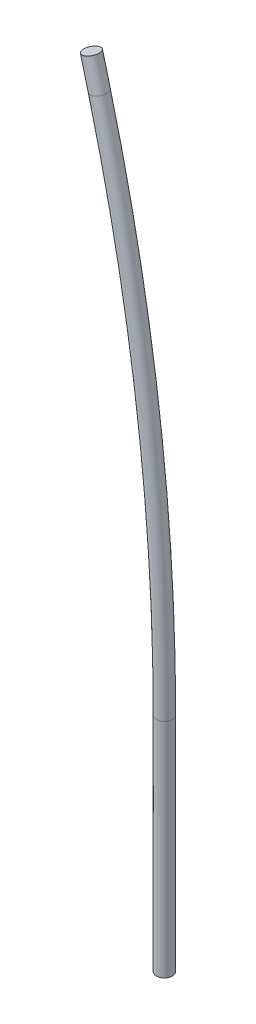
ISO-10303-21;
HEADER;
FILE_DESCRIPTION(('STEP AP214'),'2;1');
FILE_NAME('part.step','',(''),(''),'','','');
FILE_SCHEMA(('AUTOMOTIVE_DESIGN { 1 0 10303 214 1 1 1 1 }'));
ENDSEC;
DATA;
#1=APPLICATION_CONTEXT('core data for automotive mechanical design processes');
#2=APPLICATION_PROTOCOL_DEFINITION('international standard','automotive_design',2000,#1);
#3=PRODUCT_CONTEXT('',#1,'mechanical');
#4=PRODUCT('Part','Part','',(#3));
#5=PRODUCT_RELATED_PRODUCT_CATEGORY('part','',(#4));
#6=PRODUCT_DEFINITION_FORMATION('','',#4);
#7=PRODUCT_DEFINITION_CONTEXT('part definition',#1,'design');
#8=PRODUCT_DEFINITION('design','',#6,#7);
#9=PRODUCT_DEFINITION_SHAPE('','',#8);
#10=(LENGTH_UNIT() NAMED_UNIT(*) SI_UNIT(.MILLI.,.METRE.));
#11=(NAMED_UNIT(*) PLANE_ANGLE_UNIT() SI_UNIT($,.RADIAN.));
#12=(NAMED_UNIT(*) SI_UNIT($,.STERADIAN.) SOLID_ANGLE_UNIT());
#13=UNCERTAINTY_MEASURE_WITH_UNIT(LENGTH_MEASURE(1.E-05),#10,'distance_accuracy_value','');
#14=(GEOMETRIC_REPRESENTATION_CONTEXT(3) GLOBAL_UNCERTAINTY_ASSIGNED_CONTEXT((#13)) GLOBAL_UNIT_ASSIGNED_CONTEXT((#10,
#11,#12)) REPRESENTATION_CONTEXT('',''));
#15=CARTESIAN_POINT('',(0.,0.,0.));
#16=DIRECTION('',(0.,0.,1.));
#17=DIRECTION('',(1.,0.,0.));
#18=AXIS2_PLACEMENT_3D('',#15,#16,#17);
#19=CARTESIAN_POINT('',(-764.718109756101,0.,0.));
#20=DIRECTION('',(0.,0.,1.));
#21=DIRECTION('',(1.,0.,0.));
#22=AXIS2_PLACEMENT_3D('',#19,#20,#21);
#23=TOROIDAL_SURFACE('',#22,805.993109756101,3.175);
#24=CARTESIAN_POINT('',(41.275,0.,0.));
#25=DIRECTION('',(0.,-1.,0.));
#26=DIRECTION('',(0.,0.,-1.));
#27=AXIS2_PLACEMENT_3D('',#24,#25,#26);
#28=CIRCLE('',#27,3.175);
#29=CARTESIAN_POINT('',(44.45,0.,0.));
#30=VERTEX_POINT('',#29);
#31=EDGE_CURVE('E47',#30,#30,#28,.T.);
#32=CARTESIAN_POINT('',(15.2400000000001,203.2,0.));
#33=DIRECTION('',(-0.252111336363024,0.967698235028488,0.));
#34=DIRECTION('',(0.,0.,1.));
#35=AXIS2_PLACEMENT_3D('',#32,#33,#34);
#36=CIRCLE('',#35,3.175);
#37=CARTESIAN_POINT('',(18.3124418962156,204.000453492953,0.));
#38=VERTEX_POINT('',#37);
#39=EDGE_CURVE('E10',#38,#38,#36,.T.);
#40=CARTESIAN_POINT('',(-764.718109756101,0.,0.));
#41=DIRECTION('',(0.,0.,1.));
#42=DIRECTION('',(1.,0.,0.));
#43=AXIS2_PLACEMENT_3D('',#40,#41,#42);
#44=CIRCLE('',#43,809.168109756101);
#45=EDGE_CURVE('',#30,#38,#44,.T.);
#46=ORIENTED_EDGE('',*,*,#31,.F.);
#47=ORIENTED_EDGE('',*,*,#39,.F.);
#48=ORIENTED_EDGE('',*,*,#45,.T.);
#49=ORIENTED_EDGE('',*,*,#45,.F.);
#50=EDGE_LOOP('',(#46,#48,#47,#49));
#51=FACE_BOUND('',#50,.T.);
#52=ADVANCED_FACE('F33',(#51),#23,.T.);
#53=CARTESIAN_POINT('',(12.0381860281897,215.489767584862,0.));
#54=DIRECTION('',(0.252111336363024,-0.967698235028488,0.));
#55=DIRECTION('',(0.967698235028488,0.252111336363024,0.));
#56=AXIS2_PLACEMENT_3D('',#53,#54,#55);
#57=CYLINDRICAL_SURFACE('',#56,3.175);
#58=CARTESIAN_POINT('',(12.0381860281897,215.489767584862,0.));
#59=DIRECTION('',(-0.252111336363024,0.967698235028488,0.));
#60=DIRECTION('',(-0.967698235028488,-0.252111336363024,0.));
#61=AXIS2_PLACEMENT_3D('',#58,#59,#60);
#62=CIRCLE('',#61,3.175);
#63=CARTESIAN_POINT('',(15.1106279244051,216.290221077814,0.));
#64=VERTEX_POINT('',#63);
#65=EDGE_CURVE('E39',#64,#64,#62,.T.);
#66=CARTESIAN_POINT('',(15.1106279244051,216.290221077814,0.));
#67=CARTESIAN_POINT('',(15.1439801532782,216.162202665472,0.));
#68=CARTESIAN_POINT('',(15.1773323821512,216.03418425313,0.));
#69=CARTESIAN_POINT('',(15.2440368398972,215.778147428445,0.));
#70=CARTESIAN_POINT('',(15.2773890687703,215.650129016103,0.));
#71=CARTESIAN_POINT('',(15.3440935265163,215.394092191418,0.));
#72=CARTESIAN_POINT('',(15.3774457553893,215.266073779076,0.));
#73=CARTESIAN_POINT('',(15.4441502131354,215.010036954391,0.));
#74=CARTESIAN_POINT('',(15.4775024420084,214.882018542049,0.));
#75=CARTESIAN_POINT('',(15.5442068997545,214.625981717364,0.));
#76=CARTESIAN_POINT('',(15.5775591286275,214.497963305022,0.));
#77=CARTESIAN_POINT('',(15.6442635863735,214.241926480337,0.));
#78=CARTESIAN_POINT('',(15.6776158152466,214.113908067995,0.));
#79=CARTESIAN_POINT('',(15.7443202729926,213.857871243311,0.));
#80=CARTESIAN_POINT('',(15.7776725018656,213.729852830968,0.));
#81=CARTESIAN_POINT('',(15.8443769596117,213.473816006284,0.));
#82=CARTESIAN_POINT('',(15.8777291884847,213.345797593941,0.));
#83=CARTESIAN_POINT('',(15.9444336462308,213.089760769257,0.));
#84=CARTESIAN_POINT('',(15.9777858751038,212.961742356914,0.));
#85=CARTESIAN_POINT('',(16.0444903328498,212.70570553223,0.));
#86=CARTESIAN_POINT('',(16.0778425617229,212.577687119887,0.));
#87=CARTESIAN_POINT('',(16.1445470194689,212.321650295203,0.));
#88=CARTESIAN_POINT('',(16.1778992483419,212.19363188286,0.));
#89=CARTESIAN_POINT('',(16.244603706088,211.937595058176,0.));
#90=CARTESIAN_POINT('',(16.277955934961,211.809576645834,0.));
#91=CARTESIAN_POINT('',(16.3446603927071,211.553539821149,0.));
#92=CARTESIAN_POINT('',(16.3780126215801,211.425521408807,0.));
#93=CARTESIAN_POINT('',(16.4447170793261,211.169484584122,0.));
#94=CARTESIAN_POINT('',(16.4780693081992,211.04146617178,0.));
#95=CARTESIAN_POINT('',(16.5447737659452,210.785429347095,0.));
#96=CARTESIAN_POINT('',(16.5781259948182,210.657410934753,0.));
#97=CARTESIAN_POINT('',(16.6448304525643,210.401374110068,0.));
#98=CARTESIAN_POINT('',(16.6781826814373,210.273355697726,0.));
#99=CARTESIAN_POINT('',(16.7448871391834,210.017318873041,0.));
#100=CARTESIAN_POINT('',(16.7782393680564,209.889300460699,0.));
#101=CARTESIAN_POINT('',(16.8449438258024,209.633263636014,0.));
#102=CARTESIAN_POINT('',(16.8782960546755,209.505245223672,0.));
#103=CARTESIAN_POINT('',(16.9450005124215,209.249208398987,0.));
#104=CARTESIAN_POINT('',(16.9783527412945,209.121189986645,0.));
#105=CARTESIAN_POINT('',(17.0450571990406,208.86515316196,0.));
#106=CARTESIAN_POINT('',(17.0784094279136,208.737134749618,0.));
#107=CARTESIAN_POINT('',(17.1451138856597,208.481097924933,0.));
#108=CARTESIAN_POINT('',(17.1784661145327,208.353079512591,0.));
#109=CARTESIAN_POINT('',(17.2451705722787,208.097042687907,0.));
#110=CARTESIAN_POINT('',(17.2785228011518,207.969024275564,0.));
#111=CARTESIAN_POINT('',(17.3452272588978,207.71298745088,0.));
#112=CARTESIAN_POINT('',(17.3785794877708,207.584969038537,0.));
#113=CARTESIAN_POINT('',(17.4452839455169,207.328932213853,0.));
#114=CARTESIAN_POINT('',(17.4786361743899,207.20091380151,0.));
#115=CARTESIAN_POINT('',(17.545340632136,206.944876976826,0.));
#116=CARTESIAN_POINT('',(17.578692861009,206.816858564483,0.));
#117=CARTESIAN_POINT('',(17.645397318755,206.560821739799,0.));
#118=CARTESIAN_POINT('',(17.6787495476281,206.432803327456,0.));
#119=CARTESIAN_POINT('',(17.7454540053741,206.176766502772,0.));
#120=CARTESIAN_POINT('',(17.7788062342471,206.04874809043,0.));
#121=CARTESIAN_POINT('',(17.8455106919932,205.792711265745,0.));
#122=CARTESIAN_POINT('',(17.8788629208662,205.664692853403,0.));
#123=CARTESIAN_POINT('',(17.9455673786123,205.408656028718,0.));
#124=CARTESIAN_POINT('',(17.9789196074853,205.280637616376,0.));
#125=CARTESIAN_POINT('',(18.0456240652313,205.024600791691,0.));
#126=CARTESIAN_POINT('',(18.0789762941044,204.896582379349,0.));
#127=CARTESIAN_POINT('',(18.1456807518504,204.640545554664,0.));
#128=CARTESIAN_POINT('',(18.1790329807234,204.512527142322,0.));
#129=CARTESIAN_POINT('',(18.2457374384695,204.256490317637,0.));
#130=CARTESIAN_POINT('',(18.2790896673425,204.128471905295,0.));
#131=CARTESIAN_POINT('',(18.3124418962155,204.000453492953,0.));
#132=B_SPLINE_CURVE_WITH_KNOTS('',3,(#66,#67,#68,#69,#70,#71,#72,#73,#74,#75,#76,#77,#78,#79,
#80,#81,#82,#83,#84,#85,#86,#87,#88,#89,#90,#91,#92,#93,#94,#95,#96,#97,#98,#99,#100,#101,#102,
#103,#104,#105,#106,#107,#108,#109,#110,#111,#112,#113,#114,#115,#116,#117,#118,#119,#120,#121,
#122,#123,#124,#125,#126,#127,#128,#129,#130,#131),.UNSPECIFIED.,.F.,.F.,(4,2,2,2,2,2,2,2,2,2,2,
2,2,2,2,2,2,2,2,2,2,2,2,2,2,2,2,2,2,2,2,2,4),(0.,0.396875000000016,0.793750000000006,1.190625,
1.58750000000001,1.984375,2.38124999999999,2.77812500000001,3.175,3.57187500000001,3.96875,
4.36562499999999,4.76250000000001,5.15937499999999,5.55624999999998,5.953125,6.34999999999999,
6.74687500000001,7.14374999999999,7.54062499999998,7.9375,8.33437499999999,8.73125000000001,
9.128125,9.52499999999998,9.921875,10.31875,10.715625,11.1125,11.509375,11.90625,12.303125,
12.7),.UNSPECIFIED.);
#133=EDGE_CURVE('BSEAM56',#64,#38,#132,.T.);
#134=ORIENTED_EDGE('',*,*,#65,.F.);
#135=ORIENTED_EDGE('',*,*,#39,.T.);
#136=ORIENTED_EDGE('',*,*,#133,.T.);
#137=ORIENTED_EDGE('',*,*,#133,.F.);
#138=EDGE_LOOP('',(#134,#136,#135,#137));
#139=FACE_BOUND('',#138,.T.);
#140=ADVANCED_FACE('F56',(#139),#57,.T.);
#141=CARTESIAN_POINT('',(12.0381860281897,215.489767584862,0.));
#142=DIRECTION('',(-0.252111336363024,0.967698235028488,0.));
#143=DIRECTION('',(-0.967698235028488,-0.252111336363024,0.));
#144=AXIS2_PLACEMENT_3D('',#141,#142,#143);
#145=PLANE('',#144);
#146=ORIENTED_EDGE('',*,*,#65,.T.);
#147=EDGE_LOOP('',(#146));
#148=FACE_BOUND('',#147,.T.);
#149=ADVANCED_FACE('F61',(#148),#145,.T.);
#150=CARTESIAN_POINT('',(41.275,-88.9,0.));
#151=DIRECTION('',(0.,1.,0.));
#152=DIRECTION('',(0.,0.,1.));
#153=AXIS2_PLACEMENT_3D('',#150,#151,#152);
#154=CYLINDRICAL_SURFACE('',#153,3.175);
#155=CARTESIAN_POINT('',(41.275,-88.9,0.));
#156=DIRECTION('',(0.,-1.,0.));
#157=DIRECTION('',(0.,0.,-1.));
#158=AXIS2_PLACEMENT_3D('',#155,#156,#157);
#159=CIRCLE('',#158,3.175);
#160=CARTESIAN_POINT('',(41.275,-88.9,-3.175));
#161=VERTEX_POINT('',#160);
#162=EDGE_CURVE('E43',#161,#161,#159,.T.);
#163=ORIENTED_EDGE('',*,*,#162,.F.);
#164=EDGE_LOOP('',(#163));
#165=FACE_BOUND('',#164,.T.);
#166=ORIENTED_EDGE('',*,*,#31,.T.);
#167=EDGE_LOOP('',(#166));
#168=FACE_BOUND('',#167,.T.);
#169=ADVANCED_FACE('F53',(#165,#168),#154,.T.);
#170=CARTESIAN_POINT('',(41.275,-88.9,0.));
#171=DIRECTION('',(0.,-1.,0.));
#172=DIRECTION('',(0.,0.,-1.));
#173=AXIS2_PLACEMENT_3D('',#170,#171,#172);
#174=PLANE('',#173);
#175=ORIENTED_EDGE('',*,*,#162,.T.);
#176=EDGE_LOOP('',(#175));
#177=FACE_BOUND('',#176,.T.);
#178=ADVANCED_FACE('F70',(#177),#174,.T.);
#179=CLOSED_SHELL('',(#52,#140,#149,#169,#178));
#180=MANIFOLD_SOLID_BREP('B2',#179);
#181=ADVANCED_BREP_SHAPE_REPRESENTATION('',(#18,#180),#14);
#182=SHAPE_DEFINITION_REPRESENTATION(#9,#181);
ENDSEC;
END-ISO-10303-21;
